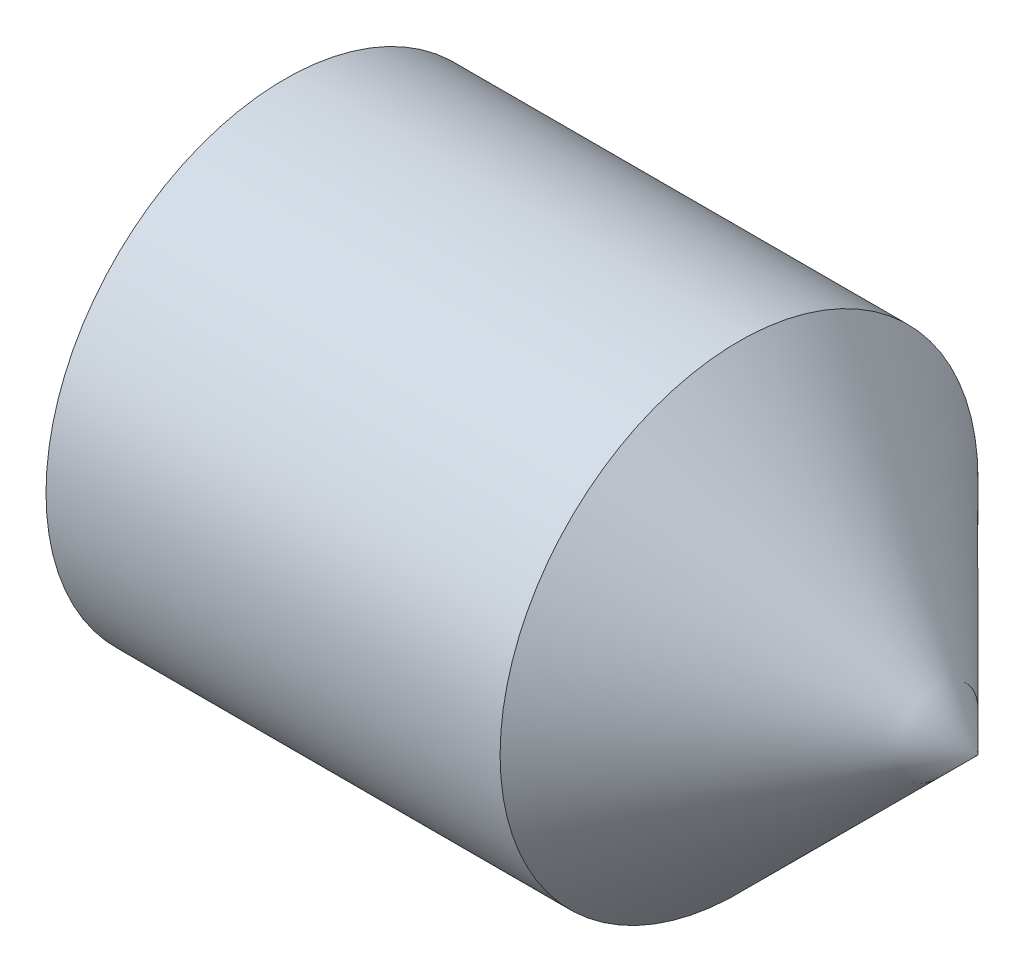
ISO-10303-21;
HEADER;
FILE_DESCRIPTION(('STEP AP214'),'2;1');
FILE_NAME('part.step','',(''),(''),'','','');
FILE_SCHEMA(('AUTOMOTIVE_DESIGN { 1 0 10303 214 1 1 1 1 }'));
ENDSEC;
DATA;
#1=APPLICATION_CONTEXT('core data for automotive mechanical design processes');
#2=APPLICATION_PROTOCOL_DEFINITION('international standard','automotive_design',2000,#1);
#3=PRODUCT_CONTEXT('',#1,'mechanical');
#4=PRODUCT('Part','Part','',(#3));
#5=PRODUCT_RELATED_PRODUCT_CATEGORY('part','',(#4));
#6=PRODUCT_DEFINITION_FORMATION('','',#4);
#7=PRODUCT_DEFINITION_CONTEXT('part definition',#1,'design');
#8=PRODUCT_DEFINITION('design','',#6,#7);
#9=PRODUCT_DEFINITION_SHAPE('','',#8);
#10=(LENGTH_UNIT() NAMED_UNIT(*) SI_UNIT(.MILLI.,.METRE.));
#11=(NAMED_UNIT(*) PLANE_ANGLE_UNIT() SI_UNIT($,.RADIAN.));
#12=(NAMED_UNIT(*) SI_UNIT($,.STERADIAN.) SOLID_ANGLE_UNIT());
#13=UNCERTAINTY_MEASURE_WITH_UNIT(LENGTH_MEASURE(1.E-05),#10,'distance_accuracy_value','');
#14=(GEOMETRIC_REPRESENTATION_CONTEXT(3) GLOBAL_UNCERTAINTY_ASSIGNED_CONTEXT((#13)) GLOBAL_UNIT_ASSIGNED_CONTEXT((#10,
#11,#12)) REPRESENTATION_CONTEXT('',''));
#15=CARTESIAN_POINT('',(0.,0.,0.));
#16=DIRECTION('',(0.,0.,1.));
#17=DIRECTION('',(1.,0.,0.));
#18=AXIS2_PLACEMENT_3D('',#15,#16,#17);
#19=CARTESIAN_POINT('',(0.,0.,0.));
#20=DIRECTION('',(-1.,0.,0.));
#21=DIRECTION('',(0.,0.,1.));
#22=AXIS2_PLACEMENT_3D('',#19,#20,#21);
#23=PLANE('',#22);
#24=CARTESIAN_POINT('',(0.,0.,0.));
#25=DIRECTION('',(-1.,0.,0.));
#26=DIRECTION('',(0.,0.,1.));
#27=AXIS2_PLACEMENT_3D('',#24,#25,#26);
#28=CIRCLE('',#27,3.3095);
#29=CARTESIAN_POINT('',(0.,0.,3.3095));
#30=VERTEX_POINT('',#29);
#31=EDGE_CURVE('E11',#30,#30,#28,.T.);
#32=ORIENTED_EDGE('',*,*,#31,.T.);
#33=EDGE_LOOP('',(#32));
#34=FACE_BOUND('',#33,.T.);
#35=DIRECTION('',(0.,0.,-1.));
#36=VECTOR('',#35,1.);
#37=CARTESIAN_POINT('',(0.,2.,1.15470053837925));
#38=LINE('',#37,#36);
#39=CARTESIAN_POINT('',(0.,2.,1.15470053837925));
#40=VERTEX_POINT('',#39);
#41=CARTESIAN_POINT('',(0.,2.,-1.15470053837926));
#42=VERTEX_POINT('',#41);
#43=EDGE_CURVE('E97',#40,#42,#38,.T.);
#44=ORIENTED_EDGE('',*,*,#43,.F.);
#45=DIRECTION('',(0.,-0.866025403784439,0.5));
#46=VECTOR('',#45,1.);
#47=CARTESIAN_POINT('',(0.,2.,1.15470053837925));
#48=LINE('',#47,#46);
#49=CARTESIAN_POINT('',(0.,0.,2.3094010767585));
#50=VERTEX_POINT('',#49);
#51=EDGE_CURVE('E50',#40,#50,#48,.T.);
#52=ORIENTED_EDGE('',*,*,#51,.T.);
#53=DIRECTION('',(0.,0.866025403784439,0.5));
#54=VECTOR('',#53,1.);
#55=CARTESIAN_POINT('',(0.,-1.99999999999999,1.15470053837925));
#56=LINE('',#55,#54);
#57=CARTESIAN_POINT('',(0.,-1.99999999999999,1.15470053837925));
#58=VERTEX_POINT('',#57);
#59=EDGE_CURVE('E103',#58,#50,#56,.T.);
#60=ORIENTED_EDGE('',*,*,#59,.F.);
#61=DIRECTION('',(0.,0.,-1.));
#62=VECTOR('',#61,1.);
#63=CARTESIAN_POINT('',(0.,-1.99999999999999,1.15470053837925));
#64=LINE('',#63,#62);
#65=CARTESIAN_POINT('',(0.,-1.99999999999999,-1.15470053837925));
#66=VERTEX_POINT('',#65);
#67=EDGE_CURVE('E123',#58,#66,#64,.T.);
#68=ORIENTED_EDGE('',*,*,#67,.T.);
#69=DIRECTION('',(0.,0.866025403784438,-0.500000000000001));
#70=VECTOR('',#69,1.);
#71=CARTESIAN_POINT('',(0.,-1.99999999999999,-1.15470053837925));
#72=LINE('',#71,#70);
#73=CARTESIAN_POINT('',(0.,0.,-2.30940107675851));
#74=VERTEX_POINT('',#73);
#75=EDGE_CURVE('E126',#66,#74,#72,.T.);
#76=ORIENTED_EDGE('',*,*,#75,.T.);
#77=DIRECTION('',(0.,-0.866025403784439,-0.5));
#78=VECTOR('',#77,1.);
#79=CARTESIAN_POINT('',(0.,2.,-1.15470053837926));
#80=LINE('',#79,#78);
#81=EDGE_CURVE('E129',#42,#74,#80,.T.);
#82=ORIENTED_EDGE('',*,*,#81,.F.);
#83=EDGE_LOOP('',(#44,#52,#60,#68,#76,#82));
#84=FACE_BOUND('',#83,.T.);
#85=ADVANCED_FACE('F36',(#34,#84),#23,.T.);
#86=CARTESIAN_POINT('',(0.,0.,0.));
#87=DIRECTION('',(1.,0.,0.));
#88=DIRECTION('',(0.,0.,-1.));
#89=AXIS2_PLACEMENT_3D('',#86,#87,#88);
#90=CONICAL_SURFACE('',#89,3.3095,1.0471975511966);
#91=CARTESIAN_POINT('',(0.398660360875434,0.,0.));
#92=DIRECTION('',(-1.,0.,0.));
#93=DIRECTION('',(0.,0.,1.));
#94=AXIS2_PLACEMENT_3D('',#91,#92,#93);
#95=CIRCLE('',#94,4.);
#96=CARTESIAN_POINT('',(0.398660360875434,0.,4.));
#97=VERTEX_POINT('',#96);
#98=EDGE_CURVE('E43',#97,#97,#95,.T.);
#99=ORIENTED_EDGE('',*,*,#98,.T.);
#100=EDGE_LOOP('',(#99));
#101=FACE_BOUND('',#100,.T.);
#102=ORIENTED_EDGE('',*,*,#31,.F.);
#103=EDGE_LOOP('',(#102));
#104=FACE_BOUND('',#103,.T.);
#105=ADVANCED_FACE('F146',(#101,#104),#90,.T.);
#106=CARTESIAN_POINT('',(-12.7,0.,0.));
#107=DIRECTION('',(-1.,0.,0.));
#108=DIRECTION('',(0.,0.,1.));
#109=AXIS2_PLACEMENT_3D('',#106,#107,#108);
#110=CYLINDRICAL_SURFACE('',#109,4.);
#111=CARTESIAN_POINT('',(8.00000000000002,0.,0.));
#112=DIRECTION('',(-1.,0.,0.));
#113=DIRECTION('',(0.,0.,1.));
#114=AXIS2_PLACEMENT_3D('',#111,#112,#113);
#115=CIRCLE('',#114,4.);
#116=CARTESIAN_POINT('',(8.00000000000002,0.,4.));
#117=VERTEX_POINT('',#116);
#118=EDGE_CURVE('E104',#117,#117,#115,.T.);
#119=ORIENTED_EDGE('',*,*,#118,.T.);
#120=EDGE_LOOP('',(#119));
#121=FACE_BOUND('',#120,.T.);
#122=ORIENTED_EDGE('',*,*,#98,.F.);
#123=EDGE_LOOP('',(#122));
#124=FACE_BOUND('',#123,.T.);
#125=ADVANCED_FACE('F149',(#121,#124),#110,.T.);
#126=CARTESIAN_POINT('',(8.00000000000002,0.,0.));
#127=DIRECTION('',(-1.,0.,0.));
#128=DIRECTION('',(0.,0.,1.));
#129=AXIS2_PLACEMENT_3D('',#126,#127,#128);
#130=CONICAL_SURFACE('',#129,4.,0.78539816339745);
#131=CARTESIAN_POINT('',(12.,0.,0.));
#132=VERTEX_POINT('',#131);
#133=VERTEX_LOOP('',#132);
#134=FACE_BOUND('',#133,.T.);
#135=ORIENTED_EDGE('',*,*,#118,.F.);
#136=EDGE_LOOP('',(#135));
#137=FACE_BOUND('',#136,.T.);
#138=ADVANCED_FACE('F151',(#134,#137),#130,.T.);
#139=CARTESIAN_POINT('',(5.,2.,1.15470053837925));
#140=DIRECTION('',(0.,-0.5,-0.866025403784438));
#141=DIRECTION('',(0.,0.866025403784438,-0.5));
#142=AXIS2_PLACEMENT_3D('',#139,#140,#141);
#143=PLANE('',#142);
#144=ORIENTED_EDGE('',*,*,#51,.F.);
#145=DIRECTION('',(-1.,0.,0.));
#146=VECTOR('',#145,1.);
#147=CARTESIAN_POINT('',(5.,2.,1.15470053837925));
#148=LINE('',#147,#146);
#149=CARTESIAN_POINT('',(5.,2.,1.15470053837925));
#150=VERTEX_POINT('',#149);
#151=EDGE_CURVE('E91',#150,#40,#148,.T.);
#152=ORIENTED_EDGE('',*,*,#151,.F.);
#153=DIRECTION('',(0.,-0.866025403784439,0.5));
#154=VECTOR('',#153,1.);
#155=CARTESIAN_POINT('',(5.,2.,1.15470053837925));
#156=LINE('',#155,#154);
#157=CARTESIAN_POINT('',(5.,0.,2.3094010767585));
#158=VERTEX_POINT('',#157);
#159=EDGE_CURVE('E86',#150,#158,#156,.T.);
#160=ORIENTED_EDGE('',*,*,#159,.T.);
#161=DIRECTION('',(-1.,0.,0.));
#162=VECTOR('',#161,1.);
#163=CARTESIAN_POINT('',(5.,0.,2.3094010767585));
#164=LINE('',#163,#162);
#165=EDGE_CURVE('E89',#158,#50,#164,.T.);
#166=ORIENTED_EDGE('',*,*,#165,.T.);
#167=EDGE_LOOP('',(#144,#152,#160,#166));
#168=FACE_BOUND('',#167,.T.);
#169=ADVANCED_FACE('F88',(#168),#143,.T.);
#170=CARTESIAN_POINT('',(5.,-1.99999999999999,1.15470053837925));
#171=DIRECTION('',(0.,-0.5,0.866025403784439));
#172=DIRECTION('',(0.,-0.866025403784439,-0.5));
#173=AXIS2_PLACEMENT_3D('',#170,#171,#172);
#174=PLANE('',#173);
#175=ORIENTED_EDGE('',*,*,#59,.T.);
#176=ORIENTED_EDGE('',*,*,#165,.F.);
#177=DIRECTION('',(0.,0.866025403784439,0.5));
#178=VECTOR('',#177,1.);
#179=CARTESIAN_POINT('',(5.,-1.99999999999999,1.15470053837925));
#180=LINE('',#179,#178);
#181=CARTESIAN_POINT('',(5.,-1.99999999999999,1.15470053837925));
#182=VERTEX_POINT('',#181);
#183=EDGE_CURVE('E96',#182,#158,#180,.T.);
#184=ORIENTED_EDGE('',*,*,#183,.F.);
#185=DIRECTION('',(-1.,0.,0.));
#186=VECTOR('',#185,1.);
#187=CARTESIAN_POINT('',(5.,-1.99999999999999,1.15470053837925));
#188=LINE('',#187,#186);
#189=EDGE_CURVE('E105',#182,#58,#188,.T.);
#190=ORIENTED_EDGE('',*,*,#189,.T.);
#191=EDGE_LOOP('',(#175,#176,#184,#190));
#192=FACE_BOUND('',#191,.T.);
#193=ADVANCED_FACE('F101',(#192),#174,.F.);
#194=CARTESIAN_POINT('',(5.,-1.99999999999999,1.15470053837925));
#195=DIRECTION('',(0.,1.,0.));
#196=DIRECTION('',(0.,0.,1.));
#197=AXIS2_PLACEMENT_3D('',#194,#195,#196);
#198=PLANE('',#197);
#199=ORIENTED_EDGE('',*,*,#67,.F.);
#200=ORIENTED_EDGE('',*,*,#189,.F.);
#201=DIRECTION('',(0.,0.,-1.));
#202=VECTOR('',#201,1.);
#203=CARTESIAN_POINT('',(5.,-1.99999999999999,1.15470053837925));
#204=LINE('',#203,#202);
#205=CARTESIAN_POINT('',(5.,-1.99999999999999,-1.15470053837925));
#206=VERTEX_POINT('',#205);
#207=EDGE_CURVE('E110',#182,#206,#204,.T.);
#208=ORIENTED_EDGE('',*,*,#207,.T.);
#209=DIRECTION('',(-1.,0.,0.));
#210=VECTOR('',#209,1.);
#211=CARTESIAN_POINT('',(5.,-1.99999999999999,-1.15470053837925));
#212=LINE('',#211,#210);
#213=EDGE_CURVE('E139',#206,#66,#212,.T.);
#214=ORIENTED_EDGE('',*,*,#213,.T.);
#215=EDGE_LOOP('',(#199,#200,#208,#214));
#216=FACE_BOUND('',#215,.T.);
#217=ADVANCED_FACE('F179',(#216),#198,.T.);
#218=CARTESIAN_POINT('',(5.,-1.99999999999999,-1.15470053837925));
#219=DIRECTION('',(0.,0.500000000000001,0.866025403784438));
#220=DIRECTION('',(0.,-0.866025403784438,0.500000000000001));
#221=AXIS2_PLACEMENT_3D('',#218,#219,#220);
#222=PLANE('',#221);
#223=ORIENTED_EDGE('',*,*,#75,.F.);
#224=ORIENTED_EDGE('',*,*,#213,.F.);
#225=DIRECTION('',(0.,0.866025403784438,-0.500000000000001));
#226=VECTOR('',#225,1.);
#227=CARTESIAN_POINT('',(5.,-1.99999999999999,-1.15470053837925));
#228=LINE('',#227,#226);
#229=CARTESIAN_POINT('',(5.,0.,-2.30940107675851));
#230=VERTEX_POINT('',#229);
#231=EDGE_CURVE('E112',#206,#230,#228,.T.);
#232=ORIENTED_EDGE('',*,*,#231,.T.);
#233=DIRECTION('',(-1.,0.,0.));
#234=VECTOR('',#233,1.);
#235=CARTESIAN_POINT('',(5.,0.,-2.30940107675851));
#236=LINE('',#235,#234);
#237=EDGE_CURVE('E137',#230,#74,#236,.T.);
#238=ORIENTED_EDGE('',*,*,#237,.T.);
#239=EDGE_LOOP('',(#223,#224,#232,#238));
#240=FACE_BOUND('',#239,.T.);
#241=ADVANCED_FACE('F175',(#240),#222,.T.);
#242=CARTESIAN_POINT('',(5.,2.,-1.15470053837926));
#243=DIRECTION('',(0.,0.5,-0.866025403784439));
#244=DIRECTION('',(0.,0.866025403784439,0.5));
#245=AXIS2_PLACEMENT_3D('',#242,#243,#244);
#246=PLANE('',#245);
#247=ORIENTED_EDGE('',*,*,#81,.T.);
#248=ORIENTED_EDGE('',*,*,#237,.F.);
#249=DIRECTION('',(0.,-0.866025403784439,-0.5));
#250=VECTOR('',#249,1.);
#251=CARTESIAN_POINT('',(5.,2.,-1.15470053837926));
#252=LINE('',#251,#250);
#253=CARTESIAN_POINT('',(5.,2.,-1.15470053837926));
#254=VERTEX_POINT('',#253);
#255=EDGE_CURVE('E116',#254,#230,#252,.T.);
#256=ORIENTED_EDGE('',*,*,#255,.F.);
#257=DIRECTION('',(-1.,0.,0.));
#258=VECTOR('',#257,1.);
#259=CARTESIAN_POINT('',(5.,2.,-1.15470053837926));
#260=LINE('',#259,#258);
#261=EDGE_CURVE('E135',#254,#42,#260,.T.);
#262=ORIENTED_EDGE('',*,*,#261,.T.);
#263=EDGE_LOOP('',(#247,#248,#256,#262));
#264=FACE_BOUND('',#263,.T.);
#265=ADVANCED_FACE('F172',(#264),#246,.F.);
#266=CARTESIAN_POINT('',(5.,2.,1.15470053837925));
#267=DIRECTION('',(0.,1.,0.));
#268=DIRECTION('',(0.,0.,1.));
#269=AXIS2_PLACEMENT_3D('',#266,#267,#268);
#270=PLANE('',#269);
#271=ORIENTED_EDGE('',*,*,#43,.T.);
#272=ORIENTED_EDGE('',*,*,#261,.F.);
#273=DIRECTION('',(0.,0.,-1.));
#274=VECTOR('',#273,1.);
#275=CARTESIAN_POINT('',(5.,2.,1.15470053837925));
#276=LINE('',#275,#274);
#277=EDGE_CURVE('E119',#150,#254,#276,.T.);
#278=ORIENTED_EDGE('',*,*,#277,.F.);
#279=ORIENTED_EDGE('',*,*,#151,.T.);
#280=EDGE_LOOP('',(#271,#272,#278,#279));
#281=FACE_BOUND('',#280,.T.);
#282=ADVANCED_FACE('F168',(#281),#270,.F.);
#283=CARTESIAN_POINT('',(5.,4.,0.));
#284=DIRECTION('',(1.,0.,0.));
#285=DIRECTION('',(0.,0.,-1.));
#286=AXIS2_PLACEMENT_3D('',#283,#284,#285);
#287=PLANE('',#286);
#288=ORIENTED_EDGE('',*,*,#159,.F.);
#289=ORIENTED_EDGE('',*,*,#277,.T.);
#290=ORIENTED_EDGE('',*,*,#255,.T.);
#291=ORIENTED_EDGE('',*,*,#231,.F.);
#292=ORIENTED_EDGE('',*,*,#207,.F.);
#293=ORIENTED_EDGE('',*,*,#183,.T.);
#294=EDGE_LOOP('',(#288,#289,#290,#291,#292,#293));
#295=FACE_BOUND('',#294,.T.);
#296=ADVANCED_FACE('F108',(#295),#287,.F.);
#297=CLOSED_SHELL('',(#85,#105,#125,#138,#169,#193,#217,#241,#265,#282,#296));
#298=MANIFOLD_SOLID_BREP('B2',#297);
#299=ADVANCED_BREP_SHAPE_REPRESENTATION('',(#18,#298),#14);
#300=SHAPE_DEFINITION_REPRESENTATION(#9,#299);
ENDSEC;
END-ISO-10303-21;
